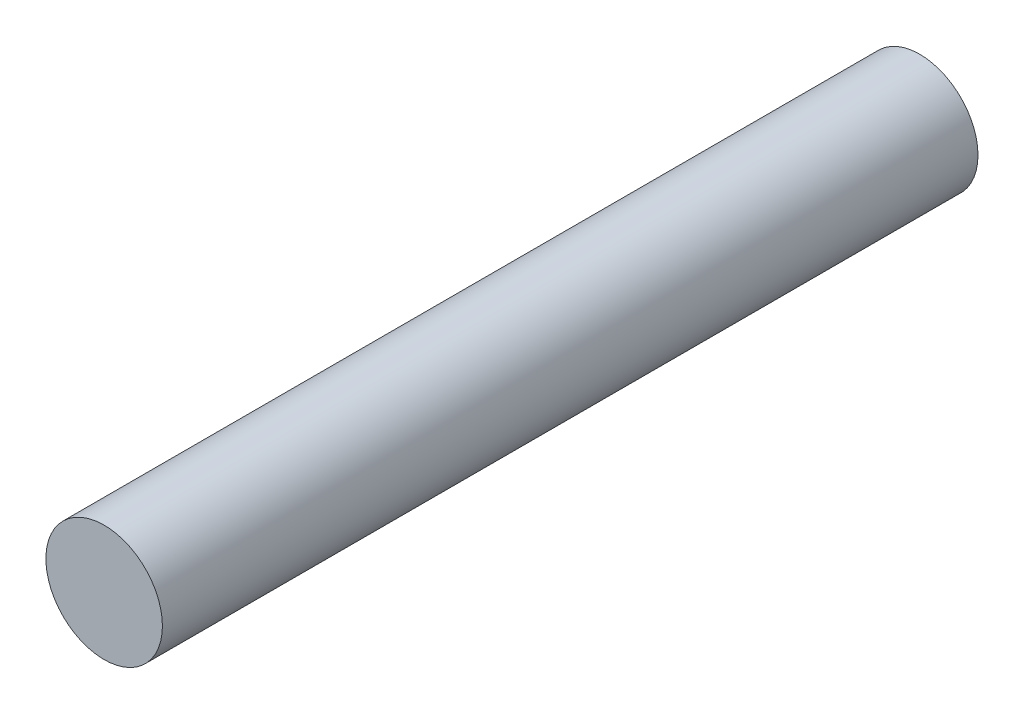
ISO-10303-21;
HEADER;
FILE_DESCRIPTION(('STEP AP214'),'2;1');
FILE_NAME('part.step','',(''),(''),'','','');
FILE_SCHEMA(('AUTOMOTIVE_DESIGN { 1 0 10303 214 1 1 1 1 }'));
ENDSEC;
DATA;
#1=APPLICATION_CONTEXT('core data for automotive mechanical design processes');
#2=APPLICATION_PROTOCOL_DEFINITION('international standard','automotive_design',2000,#1);
#3=PRODUCT_CONTEXT('',#1,'mechanical');
#4=PRODUCT('Part','Part','',(#3));
#5=PRODUCT_RELATED_PRODUCT_CATEGORY('part','',(#4));
#6=PRODUCT_DEFINITION_FORMATION('','',#4);
#7=PRODUCT_DEFINITION_CONTEXT('part definition',#1,'design');
#8=PRODUCT_DEFINITION('design','',#6,#7);
#9=PRODUCT_DEFINITION_SHAPE('','',#8);
#10=(LENGTH_UNIT() NAMED_UNIT(*) SI_UNIT(.MILLI.,.METRE.));
#11=(NAMED_UNIT(*) PLANE_ANGLE_UNIT() SI_UNIT($,.RADIAN.));
#12=(NAMED_UNIT(*) SI_UNIT($,.STERADIAN.) SOLID_ANGLE_UNIT());
#13=UNCERTAINTY_MEASURE_WITH_UNIT(LENGTH_MEASURE(1.E-05),#10,'distance_accuracy_value','');
#14=(GEOMETRIC_REPRESENTATION_CONTEXT(3) GLOBAL_UNCERTAINTY_ASSIGNED_CONTEXT((#13)) GLOBAL_UNIT_ASSIGNED_CONTEXT((#10,
#11,#12)) REPRESENTATION_CONTEXT('',''));
#15=CARTESIAN_POINT('',(0.,0.,0.));
#16=DIRECTION('',(0.,0.,1.));
#17=DIRECTION('',(1.,0.,0.));
#18=AXIS2_PLACEMENT_3D('',#15,#16,#17);
#19=CARTESIAN_POINT('',(0.,0.,56.));
#20=DIRECTION('',(0.,0.,-1.));
#21=DIRECTION('',(-1.,0.,0.));
#22=AXIS2_PLACEMENT_3D('',#19,#20,#21);
#23=CYLINDRICAL_SURFACE('',#22,4.);
#24=CARTESIAN_POINT('',(0.,0.,56.));
#25=DIRECTION('',(0.,0.,1.));
#26=DIRECTION('',(1.,0.,0.));
#27=AXIS2_PLACEMENT_3D('',#24,#25,#26);
#28=CIRCLE('',#27,4.);
#29=CARTESIAN_POINT('',(4.,0.,56.));
#30=VERTEX_POINT('',#29);
#31=EDGE_CURVE('E10',#30,#30,#28,.T.);
#32=ORIENTED_EDGE('',*,*,#31,.F.);
#33=EDGE_LOOP('',(#32));
#34=FACE_BOUND('',#33,.T.);
#35=CARTESIAN_POINT('',(0.,0.,0.));
#36=DIRECTION('',(0.,0.,1.));
#37=DIRECTION('',(1.,0.,0.));
#38=AXIS2_PLACEMENT_3D('',#35,#36,#37);
#39=CIRCLE('',#38,4.);
#40=CARTESIAN_POINT('',(4.,0.,0.));
#41=VERTEX_POINT('',#40);
#42=EDGE_CURVE('E34',#41,#41,#39,.T.);
#43=ORIENTED_EDGE('',*,*,#42,.T.);
#44=EDGE_LOOP('',(#43));
#45=FACE_BOUND('',#44,.T.);
#46=ADVANCED_FACE('F31',(#34,#45),#23,.T.);
#47=CARTESIAN_POINT('',(0.,0.,56.));
#48=DIRECTION('',(0.,0.,1.));
#49=DIRECTION('',(1.,0.,0.));
#50=AXIS2_PLACEMENT_3D('',#47,#48,#49);
#51=PLANE('',#50);
#52=ORIENTED_EDGE('',*,*,#31,.T.);
#53=EDGE_LOOP('',(#52));
#54=FACE_BOUND('',#53,.T.);
#55=ADVANCED_FACE('F46',(#54),#51,.T.);
#56=CARTESIAN_POINT('',(0.,0.,0.));
#57=DIRECTION('',(0.,0.,1.));
#58=DIRECTION('',(1.,0.,0.));
#59=AXIS2_PLACEMENT_3D('',#56,#57,#58);
#60=PLANE('',#59);
#61=ORIENTED_EDGE('',*,*,#42,.F.);
#62=EDGE_LOOP('',(#61));
#63=FACE_BOUND('',#62,.T.);
#64=ADVANCED_FACE('F44',(#63),#60,.F.);
#65=CLOSED_SHELL('',(#46,#55,#64));
#66=MANIFOLD_SOLID_BREP('B2',#65);
#67=ADVANCED_BREP_SHAPE_REPRESENTATION('',(#18,#66),#14);
#68=SHAPE_DEFINITION_REPRESENTATION(#9,#67);
ENDSEC;
END-ISO-10303-21;
